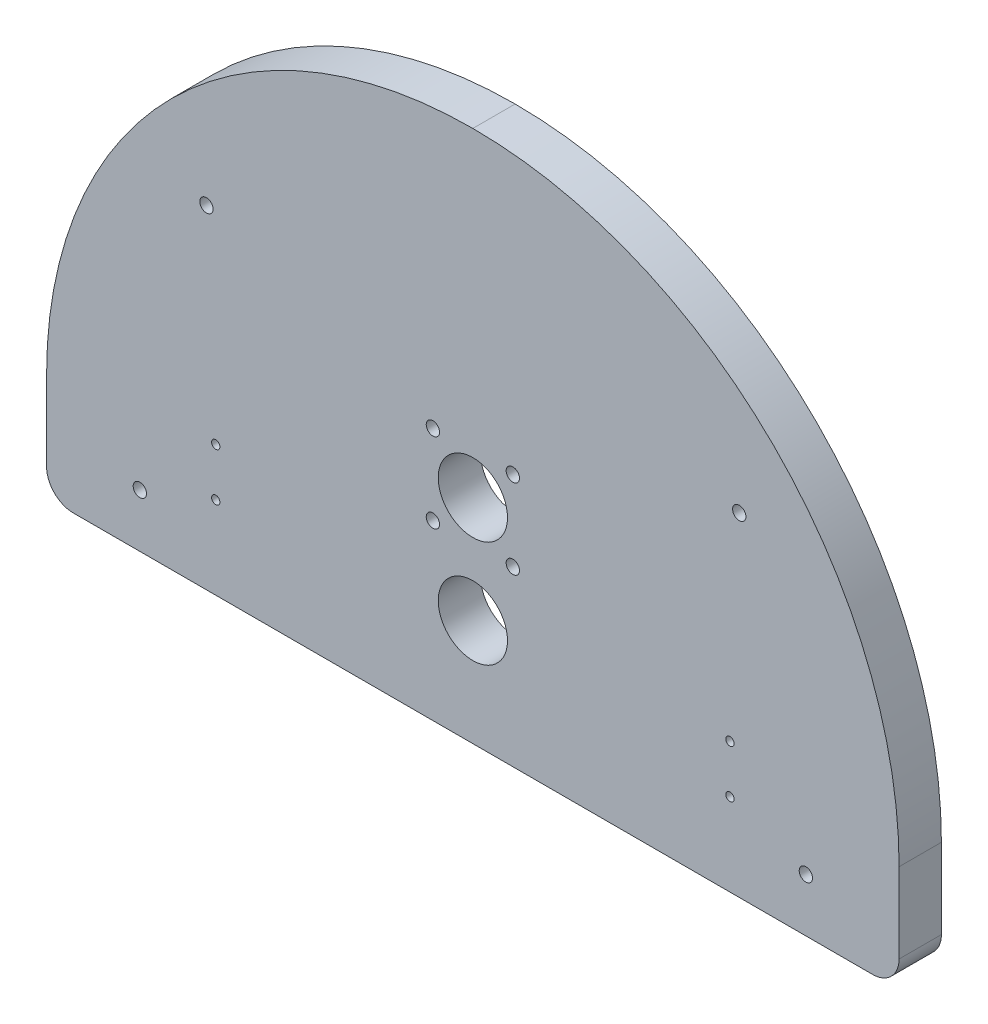
ISO-10303-21;
HEADER;
FILE_DESCRIPTION(('STEP AP214'),'2;1');
FILE_NAME('part.step','',(''),(''),'','','');
FILE_SCHEMA(('AUTOMOTIVE_DESIGN { 1 0 10303 214 1 1 1 1 }'));
ENDSEC;
DATA;
#1=APPLICATION_CONTEXT('core data for automotive mechanical design processes');
#2=APPLICATION_PROTOCOL_DEFINITION('international standard','automotive_design',2000,#1);
#3=PRODUCT_CONTEXT('',#1,'mechanical');
#4=PRODUCT('Part','Part','',(#3));
#5=PRODUCT_RELATED_PRODUCT_CATEGORY('part','',(#4));
#6=PRODUCT_DEFINITION_FORMATION('','',#4);
#7=PRODUCT_DEFINITION_CONTEXT('part definition',#1,'design');
#8=PRODUCT_DEFINITION('design','',#6,#7);
#9=PRODUCT_DEFINITION_SHAPE('','',#8);
#10=(LENGTH_UNIT() NAMED_UNIT(*) SI_UNIT(.MILLI.,.METRE.));
#11=(NAMED_UNIT(*) PLANE_ANGLE_UNIT() SI_UNIT($,.RADIAN.));
#12=(NAMED_UNIT(*) SI_UNIT($,.STERADIAN.) SOLID_ANGLE_UNIT());
#13=UNCERTAINTY_MEASURE_WITH_UNIT(LENGTH_MEASURE(1.E-05),#10,'distance_accuracy_value','');
#14=(GEOMETRIC_REPRESENTATION_CONTEXT(3) GLOBAL_UNCERTAINTY_ASSIGNED_CONTEXT((#13)) GLOBAL_UNIT_ASSIGNED_CONTEXT((#10,
#11,#12)) REPRESENTATION_CONTEXT('',''));
#15=CARTESIAN_POINT('',(0.,0.,0.));
#16=DIRECTION('',(0.,0.,1.));
#17=DIRECTION('',(1.,0.,0.));
#18=AXIS2_PLACEMENT_3D('',#15,#16,#17);
#19=CARTESIAN_POINT('',(160.,100.,15.875));
#20=DIRECTION('',(-1.,0.,0.));
#21=DIRECTION('',(0.,-1.,0.));
#22=AXIS2_PLACEMENT_3D('',#19,#20,#21);
#23=PLANE('',#22);
#24=DIRECTION('',(0.,1.,0.));
#25=VECTOR('',#24,1.);
#26=CARTESIAN_POINT('',(160.,100.,15.875));
#27=LINE('',#26,#25);
#28=CARTESIAN_POINT('',(160.,-90.,15.875));
#29=VERTEX_POINT('',#28);
#30=CARTESIAN_POINT('',(160.,-60.,15.875));
#31=VERTEX_POINT('',#30);
#32=EDGE_CURVE('E121',#29,#31,#27,.T.);
#33=ORIENTED_EDGE('',*,*,#32,.F.);
#34=DIRECTION('',(0.,0.,-1.));
#35=VECTOR('',#34,1.);
#36=CARTESIAN_POINT('',(160.,-90.,15.875));
#37=LINE('',#36,#35);
#38=CARTESIAN_POINT('',(160.,-90.,0.));
#39=VERTEX_POINT('',#38);
#40=EDGE_CURVE('E11',#29,#39,#37,.T.);
#41=ORIENTED_EDGE('',*,*,#40,.T.);
#42=DIRECTION('',(0.,1.,0.));
#43=VECTOR('',#42,1.);
#44=CARTESIAN_POINT('',(160.,100.,0.));
#45=LINE('',#44,#43);
#46=CARTESIAN_POINT('',(160.,-60.,0.));
#47=VERTEX_POINT('',#46);
#48=EDGE_CURVE('E118',#39,#47,#45,.T.);
#49=ORIENTED_EDGE('',*,*,#48,.T.);
#50=DIRECTION('',(0.,0.,-1.));
#51=VECTOR('',#50,1.);
#52=CARTESIAN_POINT('',(160.,-60.,15.875));
#53=LINE('',#52,#51);
#54=EDGE_CURVE('E130',#47,#31,#53,.F.);
#55=ORIENTED_EDGE('',*,*,#54,.T.);
#56=EDGE_LOOP('',(#33,#41,#49,#55));
#57=FACE_BOUND('',#56,.T.);
#58=ADVANCED_FACE('F33',(#57),#23,.F.);
#59=CARTESIAN_POINT('',(-160.,100.,15.875));
#60=DIRECTION('',(1.,0.,0.));
#61=DIRECTION('',(0.,0.,-1.));
#62=AXIS2_PLACEMENT_3D('',#59,#60,#61);
#63=PLANE('',#62);
#64=DIRECTION('',(0.,-1.,0.));
#65=VECTOR('',#64,1.);
#66=CARTESIAN_POINT('',(-160.,100.,0.));
#67=LINE('',#66,#65);
#68=CARTESIAN_POINT('',(-160.,-60.,0.));
#69=VERTEX_POINT('',#68);
#70=CARTESIAN_POINT('',(-160.,-90.,0.));
#71=VERTEX_POINT('',#70);
#72=EDGE_CURVE('E110',#69,#71,#67,.T.);
#73=ORIENTED_EDGE('',*,*,#72,.T.);
#74=DIRECTION('',(0.,0.,-1.));
#75=VECTOR('',#74,1.);
#76=CARTESIAN_POINT('',(-160.,-90.,15.875));
#77=LINE('',#76,#75);
#78=CARTESIAN_POINT('',(-160.,-90.,15.875));
#79=VERTEX_POINT('',#78);
#80=EDGE_CURVE('E56',#71,#79,#77,.F.);
#81=ORIENTED_EDGE('',*,*,#80,.T.);
#82=DIRECTION('',(0.,-1.,0.));
#83=VECTOR('',#82,1.);
#84=CARTESIAN_POINT('',(-160.,100.,15.875));
#85=LINE('',#84,#83);
#86=CARTESIAN_POINT('',(-160.,-60.,15.875));
#87=VERTEX_POINT('',#86);
#88=EDGE_CURVE('E111',#87,#79,#85,.T.);
#89=ORIENTED_EDGE('',*,*,#88,.F.);
#90=DIRECTION('',(0.,0.,-1.));
#91=VECTOR('',#90,1.);
#92=CARTESIAN_POINT('',(-160.,-60.,15.875));
#93=LINE('',#92,#91);
#94=EDGE_CURVE('E99',#87,#69,#93,.T.);
#95=ORIENTED_EDGE('',*,*,#94,.T.);
#96=EDGE_LOOP('',(#73,#81,#89,#95));
#97=FACE_BOUND('',#96,.T.);
#98=ADVANCED_FACE('F109',(#97),#63,.F.);
#99=CARTESIAN_POINT('',(-160.,-100.,15.875));
#100=DIRECTION('',(0.,1.,0.));
#101=DIRECTION('',(0.,0.,1.));
#102=AXIS2_PLACEMENT_3D('',#99,#100,#101);
#103=PLANE('',#102);
#104=DIRECTION('',(1.,0.,0.));
#105=VECTOR('',#104,1.);
#106=CARTESIAN_POINT('',(-160.,-100.,15.875));
#107=LINE('',#106,#105);
#108=CARTESIAN_POINT('',(-150.,-100.,15.875));
#109=VERTEX_POINT('',#108);
#110=CARTESIAN_POINT('',(150.,-100.,15.875));
#111=VERTEX_POINT('',#110);
#112=EDGE_CURVE('E112',#109,#111,#107,.T.);
#113=ORIENTED_EDGE('',*,*,#112,.F.);
#114=DIRECTION('',(0.,0.,-1.));
#115=VECTOR('',#114,1.);
#116=CARTESIAN_POINT('',(-150.,-100.,15.875));
#117=LINE('',#116,#115);
#118=CARTESIAN_POINT('',(-150.,-100.,0.));
#119=VERTEX_POINT('',#118);
#120=EDGE_CURVE('E137',#109,#119,#117,.T.);
#121=ORIENTED_EDGE('',*,*,#120,.T.);
#122=DIRECTION('',(1.,0.,0.));
#123=VECTOR('',#122,1.);
#124=CARTESIAN_POINT('',(-160.,-100.,0.));
#125=LINE('',#124,#123);
#126=CARTESIAN_POINT('',(150.,-100.,0.));
#127=VERTEX_POINT('',#126);
#128=EDGE_CURVE('E117',#119,#127,#125,.T.);
#129=ORIENTED_EDGE('',*,*,#128,.T.);
#130=DIRECTION('',(0.,0.,-1.));
#131=VECTOR('',#130,1.);
#132=CARTESIAN_POINT('',(150.,-100.,15.875));
#133=LINE('',#132,#131);
#134=EDGE_CURVE('E133',#127,#111,#133,.F.);
#135=ORIENTED_EDGE('',*,*,#134,.T.);
#136=EDGE_LOOP('',(#113,#121,#129,#135));
#137=FACE_BOUND('',#136,.T.);
#138=ADVANCED_FACE('F150',(#137),#103,.F.);
#139=CARTESIAN_POINT('',(0.,0.,15.875));
#140=DIRECTION('',(0.,0.,1.));
#141=DIRECTION('',(1.,0.,0.));
#142=AXIS2_PLACEMENT_3D('',#139,#140,#141);
#143=PLANE('',#142);
#144=CARTESIAN_POINT('',(96.5,-69.,15.875));
#145=DIRECTION('',(0.,0.,-1.));
#146=DIRECTION('',(-1.,0.,0.));
#147=AXIS2_PLACEMENT_3D('',#144,#145,#146);
#148=CIRCLE('',#147,1.5625);
#149=CARTESIAN_POINT('',(94.9375,-69.,15.875));
#150=VERTEX_POINT('',#149);
#151=EDGE_CURVE('E261',#150,#150,#148,.T.);
#152=ORIENTED_EDGE('',*,*,#151,.T.);
#153=EDGE_LOOP('',(#152));
#154=FACE_BOUND('',#153,.T.);
#155=CARTESIAN_POINT('',(96.5,-51.,15.875));
#156=DIRECTION('',(0.,0.,-1.));
#157=DIRECTION('',(-1.,0.,0.));
#158=AXIS2_PLACEMENT_3D('',#155,#156,#157);
#159=CIRCLE('',#158,1.5625);
#160=CARTESIAN_POINT('',(94.9375,-51.,15.875));
#161=VERTEX_POINT('',#160);
#162=EDGE_CURVE('E255',#161,#161,#159,.T.);
#163=ORIENTED_EDGE('',*,*,#162,.T.);
#164=EDGE_LOOP('',(#163));
#165=FACE_BOUND('',#164,.T.);
#166=CARTESIAN_POINT('',(-96.5,-68.9999999999999,15.875));
#167=DIRECTION('',(0.,0.,-1.));
#168=DIRECTION('',(-1.,0.,0.));
#169=AXIS2_PLACEMENT_3D('',#166,#167,#168);
#170=CIRCLE('',#169,1.5625);
#171=CARTESIAN_POINT('',(-98.0625,-68.9999999999999,15.875));
#172=VERTEX_POINT('',#171);
#173=EDGE_CURVE('E249',#172,#172,#170,.T.);
#174=ORIENTED_EDGE('',*,*,#173,.T.);
#175=EDGE_LOOP('',(#174));
#176=FACE_BOUND('',#175,.T.);
#177=CARTESIAN_POINT('',(-96.5,-50.9999999999999,15.875));
#178=DIRECTION('',(0.,0.,-1.));
#179=DIRECTION('',(-1.,0.,0.));
#180=AXIS2_PLACEMENT_3D('',#177,#178,#179);
#181=CIRCLE('',#180,1.5625);
#182=CARTESIAN_POINT('',(-98.0625,-50.9999999999999,15.875));
#183=VERTEX_POINT('',#182);
#184=EDGE_CURVE('E243',#183,#183,#181,.T.);
#185=ORIENTED_EDGE('',*,*,#184,.T.);
#186=EDGE_LOOP('',(#185));
#187=FACE_BOUND('',#186,.T.);
#188=CARTESIAN_POINT('',(-125.,-80.,15.875));
#189=DIRECTION('',(0.,0.,1.));
#190=DIRECTION('',(1.,0.,0.));
#191=AXIS2_PLACEMENT_3D('',#188,#189,#190);
#192=CIRCLE('',#191,2.50000000000001);
#193=CARTESIAN_POINT('',(-122.5,-80.,15.875));
#194=VERTEX_POINT('',#193);
#195=EDGE_CURVE('E240',#194,#194,#192,.T.);
#196=ORIENTED_EDGE('',*,*,#195,.F.);
#197=EDGE_LOOP('',(#196));
#198=FACE_BOUND('',#197,.T.);
#199=CARTESIAN_POINT('',(125.,-80.,15.875));
#200=DIRECTION('',(0.,0.,1.));
#201=DIRECTION('',(1.,0.,0.));
#202=AXIS2_PLACEMENT_3D('',#199,#200,#201);
#203=CIRCLE('',#202,2.5);
#204=CARTESIAN_POINT('',(127.5,-80.,15.875));
#205=VERTEX_POINT('',#204);
#206=EDGE_CURVE('E234',#205,#205,#203,.T.);
#207=ORIENTED_EDGE('',*,*,#206,.F.);
#208=EDGE_LOOP('',(#207));
#209=FACE_BOUND('',#208,.T.);
#210=CARTESIAN_POINT('',(100.,25.,15.875));
#211=DIRECTION('',(0.,0.,1.));
#212=DIRECTION('',(1.,0.,0.));
#213=AXIS2_PLACEMENT_3D('',#210,#211,#212);
#214=CIRCLE('',#213,2.5);
#215=CARTESIAN_POINT('',(102.5,25.,15.875));
#216=VERTEX_POINT('',#215);
#217=EDGE_CURVE('E228',#216,#216,#214,.T.);
#218=ORIENTED_EDGE('',*,*,#217,.F.);
#219=EDGE_LOOP('',(#218));
#220=FACE_BOUND('',#219,.T.);
#221=CARTESIAN_POINT('',(-100.,25.,15.875));
#222=DIRECTION('',(0.,0.,1.));
#223=DIRECTION('',(1.,0.,0.));
#224=AXIS2_PLACEMENT_3D('',#221,#222,#223);
#225=CIRCLE('',#224,2.5);
#226=CARTESIAN_POINT('',(-97.5,25.,15.875));
#227=VERTEX_POINT('',#226);
#228=EDGE_CURVE('E222',#227,#227,#225,.T.);
#229=ORIENTED_EDGE('',*,*,#228,.F.);
#230=EDGE_LOOP('',(#229));
#231=FACE_BOUND('',#230,.T.);
#232=CARTESIAN_POINT('',(15.,-5.,15.875));
#233=DIRECTION('',(0.,0.,1.));
#234=DIRECTION('',(1.,0.,0.));
#235=AXIS2_PLACEMENT_3D('',#232,#233,#234);
#236=CIRCLE('',#235,2.5);
#237=CARTESIAN_POINT('',(17.5,-5.,15.875));
#238=VERTEX_POINT('',#237);
#239=EDGE_CURVE('E216',#238,#238,#236,.T.);
#240=ORIENTED_EDGE('',*,*,#239,.F.);
#241=EDGE_LOOP('',(#240));
#242=FACE_BOUND('',#241,.T.);
#243=CARTESIAN_POINT('',(15.,-35.,15.875));
#244=DIRECTION('',(0.,0.,1.));
#245=DIRECTION('',(1.,0.,0.));
#246=AXIS2_PLACEMENT_3D('',#243,#244,#245);
#247=CIRCLE('',#246,2.5);
#248=CARTESIAN_POINT('',(17.5,-35.,15.875));
#249=VERTEX_POINT('',#248);
#250=EDGE_CURVE('E210',#249,#249,#247,.T.);
#251=ORIENTED_EDGE('',*,*,#250,.F.);
#252=EDGE_LOOP('',(#251));
#253=FACE_BOUND('',#252,.T.);
#254=CARTESIAN_POINT('',(-15.,-35.,15.875));
#255=DIRECTION('',(0.,0.,1.));
#256=DIRECTION('',(1.,0.,0.));
#257=AXIS2_PLACEMENT_3D('',#254,#255,#256);
#258=CIRCLE('',#257,2.5);
#259=CARTESIAN_POINT('',(-12.5,-35.,15.875));
#260=VERTEX_POINT('',#259);
#261=EDGE_CURVE('E204',#260,#260,#258,.T.);
#262=ORIENTED_EDGE('',*,*,#261,.F.);
#263=EDGE_LOOP('',(#262));
#264=FACE_BOUND('',#263,.T.);
#265=CARTESIAN_POINT('',(-15.,-5.,15.875));
#266=DIRECTION('',(0.,0.,1.));
#267=DIRECTION('',(1.,0.,0.));
#268=AXIS2_PLACEMENT_3D('',#265,#266,#267);
#269=CIRCLE('',#268,2.5);
#270=CARTESIAN_POINT('',(-12.5,-5.,15.875));
#271=VERTEX_POINT('',#270);
#272=EDGE_CURVE('E198',#271,#271,#269,.T.);
#273=ORIENTED_EDGE('',*,*,#272,.F.);
#274=EDGE_LOOP('',(#273));
#275=FACE_BOUND('',#274,.T.);
#276=CARTESIAN_POINT('',(0.,-20.,15.875));
#277=DIRECTION('',(0.,0.,1.));
#278=DIRECTION('',(1.,0.,0.));
#279=AXIS2_PLACEMENT_3D('',#276,#277,#278);
#280=CIRCLE('',#279,13.);
#281=CARTESIAN_POINT('',(13.,-20.,15.875));
#282=VERTEX_POINT('',#281);
#283=EDGE_CURVE('E192',#282,#282,#280,.T.);
#284=ORIENTED_EDGE('',*,*,#283,.F.);
#285=EDGE_LOOP('',(#284));
#286=FACE_BOUND('',#285,.T.);
#287=CARTESIAN_POINT('',(0.,-60.,15.875));
#288=DIRECTION('',(0.,0.,1.));
#289=DIRECTION('',(1.,0.,0.));
#290=AXIS2_PLACEMENT_3D('',#287,#288,#289);
#291=CIRCLE('',#290,13.);
#292=CARTESIAN_POINT('',(13.,-60.,15.875));
#293=VERTEX_POINT('',#292);
#294=EDGE_CURVE('E186',#293,#293,#291,.T.);
#295=ORIENTED_EDGE('',*,*,#294,.F.);
#296=EDGE_LOOP('',(#295));
#297=FACE_BOUND('',#296,.T.);
#298=ORIENTED_EDGE('',*,*,#88,.T.);
#299=CARTESIAN_POINT('',(-150.,-90.,15.875));
#300=DIRECTION('',(0.,0.,1.));
#301=DIRECTION('',(1.,0.,0.));
#302=AXIS2_PLACEMENT_3D('',#299,#300,#301);
#303=CIRCLE('',#302,10.);
#304=EDGE_CURVE('E41',#79,#109,#303,.T.);
#305=ORIENTED_EDGE('',*,*,#304,.T.);
#306=ORIENTED_EDGE('',*,*,#112,.T.);
#307=CARTESIAN_POINT('',(150.,-90.,15.875));
#308=DIRECTION('',(0.,0.,1.));
#309=DIRECTION('',(1.,0.,0.));
#310=AXIS2_PLACEMENT_3D('',#307,#308,#309);
#311=CIRCLE('',#310,10.);
#312=EDGE_CURVE('E48',#111,#29,#311,.T.);
#313=ORIENTED_EDGE('',*,*,#312,.T.);
#314=ORIENTED_EDGE('',*,*,#32,.T.);
#315=CARTESIAN_POINT('',(0.,-60.,15.875));
#316=DIRECTION('',(0.,0.,1.));
#317=DIRECTION('',(1.,0.,0.));
#318=AXIS2_PLACEMENT_3D('',#315,#316,#317);
#319=CIRCLE('',#318,160.);
#320=CARTESIAN_POINT('',(0.,100.,15.875));
#321=VERTEX_POINT('',#320);
#322=EDGE_CURVE('E106',#31,#321,#319,.T.);
#323=ORIENTED_EDGE('',*,*,#322,.T.);
#324=CARTESIAN_POINT('',(0.,-60.,15.875));
#325=DIRECTION('',(0.,0.,1.));
#326=DIRECTION('',(1.,0.,0.));
#327=AXIS2_PLACEMENT_3D('',#324,#325,#326);
#328=CIRCLE('',#327,160.);
#329=EDGE_CURVE('E128',#321,#87,#328,.T.);
#330=ORIENTED_EDGE('',*,*,#329,.T.);
#331=EDGE_LOOP('',(#298,#305,#306,#313,#314,#323,#330));
#332=FACE_BOUND('',#331,.T.);
#333=ADVANCED_FACE('F146',(#154,#165,#176,#187,#198,#209,#220,#231,#242,#253,#264,#275,#286,
#297,#332),#143,.T.);
#334=CARTESIAN_POINT('',(0.,0.,0.));
#335=DIRECTION('',(0.,0.,1.));
#336=DIRECTION('',(1.,0.,0.));
#337=AXIS2_PLACEMENT_3D('',#334,#335,#336);
#338=PLANE('',#337);
#339=CARTESIAN_POINT('',(96.5,-69.,0.));
#340=DIRECTION('',(0.,0.,-1.));
#341=DIRECTION('',(-1.,0.,0.));
#342=AXIS2_PLACEMENT_3D('',#339,#340,#341);
#343=CIRCLE('',#342,1.5625);
#344=CARTESIAN_POINT('',(94.9375,-69.,0.));
#345=VERTEX_POINT('',#344);
#346=EDGE_CURVE('E264',#345,#345,#343,.T.);
#347=ORIENTED_EDGE('',*,*,#346,.F.);
#348=EDGE_LOOP('',(#347));
#349=FACE_BOUND('',#348,.T.);
#350=CARTESIAN_POINT('',(96.5,-51.,0.));
#351=DIRECTION('',(0.,0.,-1.));
#352=DIRECTION('',(-1.,0.,0.));
#353=AXIS2_PLACEMENT_3D('',#350,#351,#352);
#354=CIRCLE('',#353,1.5625);
#355=CARTESIAN_POINT('',(94.9375,-51.,0.));
#356=VERTEX_POINT('',#355);
#357=EDGE_CURVE('E258',#356,#356,#354,.T.);
#358=ORIENTED_EDGE('',*,*,#357,.F.);
#359=EDGE_LOOP('',(#358));
#360=FACE_BOUND('',#359,.T.);
#361=CARTESIAN_POINT('',(-96.5,-68.9999999999999,0.));
#362=DIRECTION('',(0.,0.,-1.));
#363=DIRECTION('',(-1.,0.,0.));
#364=AXIS2_PLACEMENT_3D('',#361,#362,#363);
#365=CIRCLE('',#364,1.5625);
#366=CARTESIAN_POINT('',(-98.0625,-68.9999999999999,0.));
#367=VERTEX_POINT('',#366);
#368=EDGE_CURVE('E252',#367,#367,#365,.T.);
#369=ORIENTED_EDGE('',*,*,#368,.F.);
#370=EDGE_LOOP('',(#369));
#371=FACE_BOUND('',#370,.T.);
#372=CARTESIAN_POINT('',(-96.5,-50.9999999999999,0.));
#373=DIRECTION('',(0.,0.,-1.));
#374=DIRECTION('',(-1.,0.,0.));
#375=AXIS2_PLACEMENT_3D('',#372,#373,#374);
#376=CIRCLE('',#375,1.5625);
#377=CARTESIAN_POINT('',(-98.0625,-50.9999999999999,0.));
#378=VERTEX_POINT('',#377);
#379=EDGE_CURVE('E246',#378,#378,#376,.T.);
#380=ORIENTED_EDGE('',*,*,#379,.F.);
#381=EDGE_LOOP('',(#380));
#382=FACE_BOUND('',#381,.T.);
#383=CARTESIAN_POINT('',(-125.,-80.,0.));
#384=DIRECTION('',(0.,0.,1.));
#385=DIRECTION('',(1.,0.,0.));
#386=AXIS2_PLACEMENT_3D('',#383,#384,#385);
#387=CIRCLE('',#386,2.50000000000001);
#388=CARTESIAN_POINT('',(-122.5,-80.,0.));
#389=VERTEX_POINT('',#388);
#390=EDGE_CURVE('E237',#389,#389,#387,.T.);
#391=ORIENTED_EDGE('',*,*,#390,.T.);
#392=EDGE_LOOP('',(#391));
#393=FACE_BOUND('',#392,.T.);
#394=CARTESIAN_POINT('',(125.,-80.,0.));
#395=DIRECTION('',(0.,0.,1.));
#396=DIRECTION('',(1.,0.,0.));
#397=AXIS2_PLACEMENT_3D('',#394,#395,#396);
#398=CIRCLE('',#397,2.5);
#399=CARTESIAN_POINT('',(127.5,-80.,0.));
#400=VERTEX_POINT('',#399);
#401=EDGE_CURVE('E231',#400,#400,#398,.T.);
#402=ORIENTED_EDGE('',*,*,#401,.T.);
#403=EDGE_LOOP('',(#402));
#404=FACE_BOUND('',#403,.T.);
#405=CARTESIAN_POINT('',(100.,25.,0.));
#406=DIRECTION('',(0.,0.,1.));
#407=DIRECTION('',(1.,0.,0.));
#408=AXIS2_PLACEMENT_3D('',#405,#406,#407);
#409=CIRCLE('',#408,2.5);
#410=CARTESIAN_POINT('',(102.5,25.,0.));
#411=VERTEX_POINT('',#410);
#412=EDGE_CURVE('E225',#411,#411,#409,.T.);
#413=ORIENTED_EDGE('',*,*,#412,.T.);
#414=EDGE_LOOP('',(#413));
#415=FACE_BOUND('',#414,.T.);
#416=CARTESIAN_POINT('',(-100.,25.,0.));
#417=DIRECTION('',(0.,0.,1.));
#418=DIRECTION('',(1.,0.,0.));
#419=AXIS2_PLACEMENT_3D('',#416,#417,#418);
#420=CIRCLE('',#419,2.5);
#421=CARTESIAN_POINT('',(-97.5,25.,0.));
#422=VERTEX_POINT('',#421);
#423=EDGE_CURVE('E219',#422,#422,#420,.T.);
#424=ORIENTED_EDGE('',*,*,#423,.T.);
#425=EDGE_LOOP('',(#424));
#426=FACE_BOUND('',#425,.T.);
#427=CARTESIAN_POINT('',(15.,-5.,0.));
#428=DIRECTION('',(0.,0.,1.));
#429=DIRECTION('',(1.,0.,0.));
#430=AXIS2_PLACEMENT_3D('',#427,#428,#429);
#431=CIRCLE('',#430,2.5);
#432=CARTESIAN_POINT('',(17.5,-5.,0.));
#433=VERTEX_POINT('',#432);
#434=EDGE_CURVE('E213',#433,#433,#431,.T.);
#435=ORIENTED_EDGE('',*,*,#434,.T.);
#436=EDGE_LOOP('',(#435));
#437=FACE_BOUND('',#436,.T.);
#438=CARTESIAN_POINT('',(15.,-35.,0.));
#439=DIRECTION('',(0.,0.,1.));
#440=DIRECTION('',(1.,0.,0.));
#441=AXIS2_PLACEMENT_3D('',#438,#439,#440);
#442=CIRCLE('',#441,2.5);
#443=CARTESIAN_POINT('',(17.5,-35.,0.));
#444=VERTEX_POINT('',#443);
#445=EDGE_CURVE('E207',#444,#444,#442,.T.);
#446=ORIENTED_EDGE('',*,*,#445,.T.);
#447=EDGE_LOOP('',(#446));
#448=FACE_BOUND('',#447,.T.);
#449=CARTESIAN_POINT('',(-15.,-35.,0.));
#450=DIRECTION('',(0.,0.,1.));
#451=DIRECTION('',(1.,0.,0.));
#452=AXIS2_PLACEMENT_3D('',#449,#450,#451);
#453=CIRCLE('',#452,2.5);
#454=CARTESIAN_POINT('',(-12.5,-35.,0.));
#455=VERTEX_POINT('',#454);
#456=EDGE_CURVE('E201',#455,#455,#453,.T.);
#457=ORIENTED_EDGE('',*,*,#456,.T.);
#458=EDGE_LOOP('',(#457));
#459=FACE_BOUND('',#458,.T.);
#460=CARTESIAN_POINT('',(-15.,-5.,0.));
#461=DIRECTION('',(0.,0.,1.));
#462=DIRECTION('',(1.,0.,0.));
#463=AXIS2_PLACEMENT_3D('',#460,#461,#462);
#464=CIRCLE('',#463,2.5);
#465=CARTESIAN_POINT('',(-12.5,-5.,0.));
#466=VERTEX_POINT('',#465);
#467=EDGE_CURVE('E195',#466,#466,#464,.T.);
#468=ORIENTED_EDGE('',*,*,#467,.T.);
#469=EDGE_LOOP('',(#468));
#470=FACE_BOUND('',#469,.T.);
#471=CARTESIAN_POINT('',(0.,-20.,0.));
#472=DIRECTION('',(0.,0.,1.));
#473=DIRECTION('',(1.,0.,0.));
#474=AXIS2_PLACEMENT_3D('',#471,#472,#473);
#475=CIRCLE('',#474,13.);
#476=CARTESIAN_POINT('',(13.,-20.,0.));
#477=VERTEX_POINT('',#476);
#478=EDGE_CURVE('E189',#477,#477,#475,.T.);
#479=ORIENTED_EDGE('',*,*,#478,.T.);
#480=EDGE_LOOP('',(#479));
#481=FACE_BOUND('',#480,.T.);
#482=CARTESIAN_POINT('',(0.,-60.,0.));
#483=DIRECTION('',(0.,0.,1.));
#484=DIRECTION('',(1.,0.,0.));
#485=AXIS2_PLACEMENT_3D('',#482,#483,#484);
#486=CIRCLE('',#485,13.);
#487=CARTESIAN_POINT('',(13.,-60.,0.));
#488=VERTEX_POINT('',#487);
#489=EDGE_CURVE('E135',#488,#488,#486,.T.);
#490=ORIENTED_EDGE('',*,*,#489,.T.);
#491=EDGE_LOOP('',(#490));
#492=FACE_BOUND('',#491,.T.);
#493=ORIENTED_EDGE('',*,*,#128,.F.);
#494=CARTESIAN_POINT('',(-150.,-90.,0.));
#495=DIRECTION('',(0.,0.,1.));
#496=DIRECTION('',(1.,0.,0.));
#497=AXIS2_PLACEMENT_3D('',#494,#495,#496);
#498=CIRCLE('',#497,10.);
#499=EDGE_CURVE('E116',#119,#71,#498,.F.);
#500=ORIENTED_EDGE('',*,*,#499,.T.);
#501=ORIENTED_EDGE('',*,*,#72,.F.);
#502=CARTESIAN_POINT('',(0.,-60.,0.));
#503=DIRECTION('',(0.,0.,1.));
#504=DIRECTION('',(1.,0.,0.));
#505=AXIS2_PLACEMENT_3D('',#502,#503,#504);
#506=CIRCLE('',#505,160.);
#507=CARTESIAN_POINT('',(0.,100.,0.));
#508=VERTEX_POINT('',#507);
#509=EDGE_CURVE('E95',#69,#508,#506,.F.);
#510=ORIENTED_EDGE('',*,*,#509,.T.);
#511=CARTESIAN_POINT('',(0.,-60.,0.));
#512=DIRECTION('',(0.,0.,1.));
#513=DIRECTION('',(1.,0.,0.));
#514=AXIS2_PLACEMENT_3D('',#511,#512,#513);
#515=CIRCLE('',#514,160.);
#516=EDGE_CURVE('E107',#508,#47,#515,.F.);
#517=ORIENTED_EDGE('',*,*,#516,.T.);
#518=ORIENTED_EDGE('',*,*,#48,.F.);
#519=CARTESIAN_POINT('',(150.,-90.,0.));
#520=DIRECTION('',(0.,0.,1.));
#521=DIRECTION('',(1.,0.,0.));
#522=AXIS2_PLACEMENT_3D('',#519,#520,#521);
#523=CIRCLE('',#522,10.);
#524=EDGE_CURVE('E140',#39,#127,#523,.F.);
#525=ORIENTED_EDGE('',*,*,#524,.T.);
#526=EDGE_LOOP('',(#493,#500,#501,#510,#517,#518,#525));
#527=FACE_BOUND('',#526,.T.);
#528=ADVANCED_FACE('F115',(#349,#360,#371,#382,#393,#404,#415,#426,#437,#448,#459,#470,#481,
#492,#527),#338,.F.);
#529=CARTESIAN_POINT('',(0.,-60.,15.875));
#530=DIRECTION('',(0.,0.,-1.));
#531=DIRECTION('',(-1.,0.,0.));
#532=AXIS2_PLACEMENT_3D('',#529,#530,#531);
#533=CYLINDRICAL_SURFACE('',#532,160.);
#534=DIRECTION('',(0.,0.,-1.));
#535=VECTOR('',#534,1.);
#536=CARTESIAN_POINT('',(0.,100.,15.875));
#537=LINE('',#536,#535);
#538=EDGE_CURVE('E101',#321,#508,#537,.T.);
#539=ORIENTED_EDGE('',*,*,#538,.F.);
#540=ORIENTED_EDGE('',*,*,#322,.F.);
#541=ORIENTED_EDGE('',*,*,#54,.F.);
#542=ORIENTED_EDGE('',*,*,#516,.F.);
#543=EDGE_LOOP('',(#539,#540,#541,#542));
#544=FACE_BOUND('',#543,.T.);
#545=ADVANCED_FACE('F160',(#544),#533,.T.);
#546=CARTESIAN_POINT('',(0.,-60.,15.875));
#547=DIRECTION('',(0.,0.,-1.));
#548=DIRECTION('',(-1.,0.,0.));
#549=AXIS2_PLACEMENT_3D('',#546,#547,#548);
#550=CYLINDRICAL_SURFACE('',#549,160.);
#551=ORIENTED_EDGE('',*,*,#329,.F.);
#552=ORIENTED_EDGE('',*,*,#538,.T.);
#553=ORIENTED_EDGE('',*,*,#509,.F.);
#554=ORIENTED_EDGE('',*,*,#94,.F.);
#555=EDGE_LOOP('',(#551,#552,#553,#554));
#556=FACE_BOUND('',#555,.T.);
#557=ADVANCED_FACE('F98',(#556),#550,.T.);
#558=CARTESIAN_POINT('',(-150.,-90.,15.875));
#559=DIRECTION('',(0.,0.,-1.));
#560=DIRECTION('',(-1.,0.,0.));
#561=AXIS2_PLACEMENT_3D('',#558,#559,#560);
#562=CYLINDRICAL_SURFACE('',#561,10.);
#563=ORIENTED_EDGE('',*,*,#304,.F.);
#564=ORIENTED_EDGE('',*,*,#80,.F.);
#565=ORIENTED_EDGE('',*,*,#499,.F.);
#566=ORIENTED_EDGE('',*,*,#120,.F.);
#567=EDGE_LOOP('',(#563,#564,#565,#566));
#568=FACE_BOUND('',#567,.T.);
#569=ADVANCED_FACE('F152',(#568),#562,.T.);
#570=CARTESIAN_POINT('',(150.,-90.,15.875));
#571=DIRECTION('',(0.,0.,-1.));
#572=DIRECTION('',(-1.,0.,0.));
#573=AXIS2_PLACEMENT_3D('',#570,#571,#572);
#574=CYLINDRICAL_SURFACE('',#573,10.);
#575=ORIENTED_EDGE('',*,*,#312,.F.);
#576=ORIENTED_EDGE('',*,*,#134,.F.);
#577=ORIENTED_EDGE('',*,*,#524,.F.);
#578=ORIENTED_EDGE('',*,*,#40,.F.);
#579=EDGE_LOOP('',(#575,#576,#577,#578));
#580=FACE_BOUND('',#579,.T.);
#581=ADVANCED_FACE('F35',(#580),#574,.T.);
#582=CARTESIAN_POINT('',(0.,-60.,0.));
#583=DIRECTION('',(0.,0.,1.));
#584=DIRECTION('',(1.,0.,0.));
#585=AXIS2_PLACEMENT_3D('',#582,#583,#584);
#586=CYLINDRICAL_SURFACE('',#585,13.);
#587=ORIENTED_EDGE('',*,*,#489,.F.);
#588=EDGE_LOOP('',(#587));
#589=FACE_BOUND('',#588,.T.);
#590=ORIENTED_EDGE('',*,*,#294,.T.);
#591=EDGE_LOOP('',(#590));
#592=FACE_BOUND('',#591,.T.);
#593=ADVANCED_FACE('F158',(#589,#592),#586,.F.);
#594=CARTESIAN_POINT('',(0.,-20.,0.));
#595=DIRECTION('',(0.,0.,1.));
#596=DIRECTION('',(1.,0.,0.));
#597=AXIS2_PLACEMENT_3D('',#594,#595,#596);
#598=CYLINDRICAL_SURFACE('',#597,13.);
#599=ORIENTED_EDGE('',*,*,#478,.F.);
#600=EDGE_LOOP('',(#599));
#601=FACE_BOUND('',#600,.T.);
#602=ORIENTED_EDGE('',*,*,#283,.T.);
#603=EDGE_LOOP('',(#602));
#604=FACE_BOUND('',#603,.T.);
#605=ADVANCED_FACE('F307',(#601,#604),#598,.F.);
#606=CARTESIAN_POINT('',(-15.,-5.,0.));
#607=DIRECTION('',(0.,0.,1.));
#608=DIRECTION('',(1.,0.,0.));
#609=AXIS2_PLACEMENT_3D('',#606,#607,#608);
#610=CYLINDRICAL_SURFACE('',#609,2.5);
#611=ORIENTED_EDGE('',*,*,#467,.F.);
#612=EDGE_LOOP('',(#611));
#613=FACE_BOUND('',#612,.T.);
#614=ORIENTED_EDGE('',*,*,#272,.T.);
#615=EDGE_LOOP('',(#614));
#616=FACE_BOUND('',#615,.T.);
#617=ADVANCED_FACE('F320',(#613,#616),#610,.F.);
#618=CARTESIAN_POINT('',(-15.,-35.,0.));
#619=DIRECTION('',(0.,0.,1.));
#620=DIRECTION('',(1.,0.,0.));
#621=AXIS2_PLACEMENT_3D('',#618,#619,#620);
#622=CYLINDRICAL_SURFACE('',#621,2.5);
#623=ORIENTED_EDGE('',*,*,#456,.F.);
#624=EDGE_LOOP('',(#623));
#625=FACE_BOUND('',#624,.T.);
#626=ORIENTED_EDGE('',*,*,#261,.T.);
#627=EDGE_LOOP('',(#626));
#628=FACE_BOUND('',#627,.T.);
#629=ADVANCED_FACE('F324',(#625,#628),#622,.F.);
#630=CARTESIAN_POINT('',(15.,-35.,0.));
#631=DIRECTION('',(0.,0.,1.));
#632=DIRECTION('',(1.,0.,0.));
#633=AXIS2_PLACEMENT_3D('',#630,#631,#632);
#634=CYLINDRICAL_SURFACE('',#633,2.5);
#635=ORIENTED_EDGE('',*,*,#445,.F.);
#636=EDGE_LOOP('',(#635));
#637=FACE_BOUND('',#636,.T.);
#638=ORIENTED_EDGE('',*,*,#250,.T.);
#639=EDGE_LOOP('',(#638));
#640=FACE_BOUND('',#639,.T.);
#641=ADVANCED_FACE('F328',(#637,#640),#634,.F.);
#642=CARTESIAN_POINT('',(15.,-5.,0.));
#643=DIRECTION('',(0.,0.,1.));
#644=DIRECTION('',(1.,0.,0.));
#645=AXIS2_PLACEMENT_3D('',#642,#643,#644);
#646=CYLINDRICAL_SURFACE('',#645,2.5);
#647=ORIENTED_EDGE('',*,*,#434,.F.);
#648=EDGE_LOOP('',(#647));
#649=FACE_BOUND('',#648,.T.);
#650=ORIENTED_EDGE('',*,*,#239,.T.);
#651=EDGE_LOOP('',(#650));
#652=FACE_BOUND('',#651,.T.);
#653=ADVANCED_FACE('F332',(#649,#652),#646,.F.);
#654=CARTESIAN_POINT('',(-100.,25.,0.));
#655=DIRECTION('',(0.,0.,1.));
#656=DIRECTION('',(1.,0.,0.));
#657=AXIS2_PLACEMENT_3D('',#654,#655,#656);
#658=CYLINDRICAL_SURFACE('',#657,2.5);
#659=ORIENTED_EDGE('',*,*,#423,.F.);
#660=EDGE_LOOP('',(#659));
#661=FACE_BOUND('',#660,.T.);
#662=ORIENTED_EDGE('',*,*,#228,.T.);
#663=EDGE_LOOP('',(#662));
#664=FACE_BOUND('',#663,.T.);
#665=ADVANCED_FACE('F336',(#661,#664),#658,.F.);
#666=CARTESIAN_POINT('',(100.,25.,0.));
#667=DIRECTION('',(0.,0.,1.));
#668=DIRECTION('',(1.,0.,0.));
#669=AXIS2_PLACEMENT_3D('',#666,#667,#668);
#670=CYLINDRICAL_SURFACE('',#669,2.5);
#671=ORIENTED_EDGE('',*,*,#412,.F.);
#672=EDGE_LOOP('',(#671));
#673=FACE_BOUND('',#672,.T.);
#674=ORIENTED_EDGE('',*,*,#217,.T.);
#675=EDGE_LOOP('',(#674));
#676=FACE_BOUND('',#675,.T.);
#677=ADVANCED_FACE('F340',(#673,#676),#670,.F.);
#678=CARTESIAN_POINT('',(125.,-80.,0.));
#679=DIRECTION('',(0.,0.,1.));
#680=DIRECTION('',(1.,0.,0.));
#681=AXIS2_PLACEMENT_3D('',#678,#679,#680);
#682=CYLINDRICAL_SURFACE('',#681,2.5);
#683=ORIENTED_EDGE('',*,*,#401,.F.);
#684=EDGE_LOOP('',(#683));
#685=FACE_BOUND('',#684,.T.);
#686=ORIENTED_EDGE('',*,*,#206,.T.);
#687=EDGE_LOOP('',(#686));
#688=FACE_BOUND('',#687,.T.);
#689=ADVANCED_FACE('F344',(#685,#688),#682,.F.);
#690=CARTESIAN_POINT('',(-125.,-80.,0.));
#691=DIRECTION('',(0.,0.,1.));
#692=DIRECTION('',(1.,0.,0.));
#693=AXIS2_PLACEMENT_3D('',#690,#691,#692);
#694=CYLINDRICAL_SURFACE('',#693,2.50000000000001);
#695=ORIENTED_EDGE('',*,*,#390,.F.);
#696=EDGE_LOOP('',(#695));
#697=FACE_BOUND('',#696,.T.);
#698=ORIENTED_EDGE('',*,*,#195,.T.);
#699=EDGE_LOOP('',(#698));
#700=FACE_BOUND('',#699,.T.);
#701=ADVANCED_FACE('F348',(#697,#700),#694,.F.);
#702=CARTESIAN_POINT('',(-96.5,-50.9999999999999,15.875));
#703=DIRECTION('',(0.,0.,-1.));
#704=DIRECTION('',(-1.,0.,0.));
#705=AXIS2_PLACEMENT_3D('',#702,#703,#704);
#706=CYLINDRICAL_SURFACE('',#705,1.5625);
#707=ORIENTED_EDGE('',*,*,#184,.F.);
#708=EDGE_LOOP('',(#707));
#709=FACE_BOUND('',#708,.T.);
#710=ORIENTED_EDGE('',*,*,#379,.T.);
#711=EDGE_LOOP('',(#710));
#712=FACE_BOUND('',#711,.T.);
#713=ADVANCED_FACE('F352',(#709,#712),#706,.F.);
#714=CARTESIAN_POINT('',(-96.5,-68.9999999999999,15.875));
#715=DIRECTION('',(0.,0.,-1.));
#716=DIRECTION('',(-1.,0.,0.));
#717=AXIS2_PLACEMENT_3D('',#714,#715,#716);
#718=CYLINDRICAL_SURFACE('',#717,1.5625);
#719=ORIENTED_EDGE('',*,*,#173,.F.);
#720=EDGE_LOOP('',(#719));
#721=FACE_BOUND('',#720,.T.);
#722=ORIENTED_EDGE('',*,*,#368,.T.);
#723=EDGE_LOOP('',(#722));
#724=FACE_BOUND('',#723,.T.);
#725=ADVANCED_FACE('F356',(#721,#724),#718,.F.);
#726=CARTESIAN_POINT('',(96.5,-51.,15.875));
#727=DIRECTION('',(0.,0.,-1.));
#728=DIRECTION('',(-1.,0.,0.));
#729=AXIS2_PLACEMENT_3D('',#726,#727,#728);
#730=CYLINDRICAL_SURFACE('',#729,1.5625);
#731=ORIENTED_EDGE('',*,*,#162,.F.);
#732=EDGE_LOOP('',(#731));
#733=FACE_BOUND('',#732,.T.);
#734=ORIENTED_EDGE('',*,*,#357,.T.);
#735=EDGE_LOOP('',(#734));
#736=FACE_BOUND('',#735,.T.);
#737=ADVANCED_FACE('F275',(#733,#736),#730,.F.);
#738=CARTESIAN_POINT('',(96.5,-69.,15.875));
#739=DIRECTION('',(0.,0.,-1.));
#740=DIRECTION('',(-1.,0.,0.));
#741=AXIS2_PLACEMENT_3D('',#738,#739,#740);
#742=CYLINDRICAL_SURFACE('',#741,1.5625);
#743=ORIENTED_EDGE('',*,*,#151,.F.);
#744=EDGE_LOOP('',(#743));
#745=FACE_BOUND('',#744,.T.);
#746=ORIENTED_EDGE('',*,*,#346,.T.);
#747=EDGE_LOOP('',(#746));
#748=FACE_BOUND('',#747,.T.);
#749=ADVANCED_FACE('F272',(#745,#748),#742,.F.);
#750=CLOSED_SHELL('',(#58,#98,#138,#333,#528,#545,#557,#569,#581,#593,#605,#617,#629,#641,#653,
#665,#677,#689,#701,#713,#725,#737,#749));
#751=MANIFOLD_SOLID_BREP('B2',#750);
#752=ADVANCED_BREP_SHAPE_REPRESENTATION('',(#18,#751),#14);
#753=SHAPE_DEFINITION_REPRESENTATION(#9,#752);
ENDSEC;
END-ISO-10303-21;
